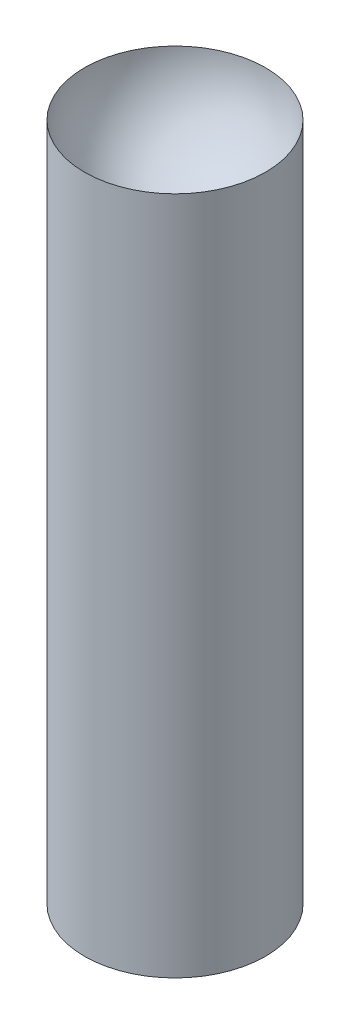
ISO-10303-21;
HEADER;
FILE_DESCRIPTION(('STEP AP214'),'2;1');
FILE_NAME('part.step','',(''),(''),'','','');
FILE_SCHEMA(('AUTOMOTIVE_DESIGN { 1 0 10303 214 1 1 1 1 }'));
ENDSEC;
DATA;
#1=APPLICATION_CONTEXT('core data for automotive mechanical design processes');
#2=APPLICATION_PROTOCOL_DEFINITION('international standard','automotive_design',2000,#1);
#3=PRODUCT_CONTEXT('',#1,'mechanical');
#4=PRODUCT('Part','Part','',(#3));
#5=PRODUCT_RELATED_PRODUCT_CATEGORY('part','',(#4));
#6=PRODUCT_DEFINITION_FORMATION('','',#4);
#7=PRODUCT_DEFINITION_CONTEXT('part definition',#1,'design');
#8=PRODUCT_DEFINITION('design','',#6,#7);
#9=PRODUCT_DEFINITION_SHAPE('','',#8);
#10=(LENGTH_UNIT() NAMED_UNIT(*) SI_UNIT(.MILLI.,.METRE.));
#11=(NAMED_UNIT(*) PLANE_ANGLE_UNIT() SI_UNIT($,.RADIAN.));
#12=(NAMED_UNIT(*) SI_UNIT($,.STERADIAN.) SOLID_ANGLE_UNIT());
#13=UNCERTAINTY_MEASURE_WITH_UNIT(LENGTH_MEASURE(1.E-05),#10,'distance_accuracy_value','');
#14=(GEOMETRIC_REPRESENTATION_CONTEXT(3) GLOBAL_UNCERTAINTY_ASSIGNED_CONTEXT((#13)) GLOBAL_UNIT_ASSIGNED_CONTEXT((#10,
#11,#12)) REPRESENTATION_CONTEXT('',''));
#15=CARTESIAN_POINT('',(0.,0.,0.));
#16=DIRECTION('',(0.,0.,1.));
#17=DIRECTION('',(1.,0.,0.));
#18=AXIS2_PLACEMENT_3D('',#15,#16,#17);
#19=CARTESIAN_POINT('',(0.,76.2,0.));
#20=DIRECTION('',(0.,-1.,0.));
#21=DIRECTION('',(0.,0.,-1.));
#22=AXIS2_PLACEMENT_3D('',#19,#20,#21);
#23=CYLINDRICAL_SURFACE('',#22,10.16);
#24=CARTESIAN_POINT('',(0.,76.2,0.));
#25=DIRECTION('',(0.,1.,0.));
#26=DIRECTION('',(0.,0.,1.));
#27=AXIS2_PLACEMENT_3D('',#24,#25,#26);
#28=CIRCLE('',#27,10.16);
#29=CARTESIAN_POINT('',(0.,76.2,-10.16));
#30=VERTEX_POINT('',#29);
#31=EDGE_CURVE('E37',#30,#30,#28,.F.);
#32=CARTESIAN_POINT('',(0.,0.,0.));
#33=DIRECTION('',(0.,1.,0.));
#34=DIRECTION('',(0.,0.,1.));
#35=AXIS2_PLACEMENT_3D('',#32,#33,#34);
#36=CIRCLE('',#35,10.16);
#37=CARTESIAN_POINT('',(0.,0.,-10.16));
#38=VERTEX_POINT('',#37);
#39=EDGE_CURVE('E10',#38,#38,#36,.T.);
#40=CARTESIAN_POINT('',(0.,76.2,-10.16));
#41=CARTESIAN_POINT('',(0.,75.40625,-10.16));
#42=CARTESIAN_POINT('',(0.,74.6125,-10.16));
#43=CARTESIAN_POINT('',(0.,73.025,-10.16));
#44=CARTESIAN_POINT('',(0.,72.23125,-10.16));
#45=CARTESIAN_POINT('',(0.,70.64375,-10.16));
#46=CARTESIAN_POINT('',(0.,69.85,-10.16));
#47=CARTESIAN_POINT('',(0.,68.2625,-10.16));
#48=CARTESIAN_POINT('',(0.,67.46875,-10.16));
#49=CARTESIAN_POINT('',(0.,65.88125,-10.16));
#50=CARTESIAN_POINT('',(0.,65.0875,-10.16));
#51=CARTESIAN_POINT('',(0.,63.5,-10.16));
#52=CARTESIAN_POINT('',(0.,62.70625,-10.16));
#53=CARTESIAN_POINT('',(0.,61.11875,-10.16));
#54=CARTESIAN_POINT('',(0.,60.325,-10.16));
#55=CARTESIAN_POINT('',(0.,58.7375,-10.16));
#56=CARTESIAN_POINT('',(0.,57.94375,-10.16));
#57=CARTESIAN_POINT('',(0.,56.35625,-10.16));
#58=CARTESIAN_POINT('',(0.,55.5625,-10.16));
#59=CARTESIAN_POINT('',(0.,53.975,-10.16));
#60=CARTESIAN_POINT('',(0.,53.18125,-10.16));
#61=CARTESIAN_POINT('',(0.,51.59375,-10.16));
#62=CARTESIAN_POINT('',(0.,50.8,-10.16));
#63=CARTESIAN_POINT('',(0.,49.2125,-10.16));
#64=CARTESIAN_POINT('',(0.,48.41875,-10.16));
#65=CARTESIAN_POINT('',(0.,46.83125,-10.16));
#66=CARTESIAN_POINT('',(0.,46.0375,-10.16));
#67=CARTESIAN_POINT('',(0.,44.45,-10.16));
#68=CARTESIAN_POINT('',(0.,43.65625,-10.16));
#69=CARTESIAN_POINT('',(0.,42.06875,-10.16));
#70=CARTESIAN_POINT('',(0.,41.275,-10.16));
#71=CARTESIAN_POINT('',(0.,39.6875,-10.16));
#72=CARTESIAN_POINT('',(0.,38.89375,-10.16));
#73=CARTESIAN_POINT('',(0.,37.30625,-10.16));
#74=CARTESIAN_POINT('',(0.,36.5125,-10.16));
#75=CARTESIAN_POINT('',(0.,34.925,-10.16));
#76=CARTESIAN_POINT('',(0.,34.13125,-10.16));
#77=CARTESIAN_POINT('',(0.,32.54375,-10.16));
#78=CARTESIAN_POINT('',(0.,31.75,-10.16));
#79=CARTESIAN_POINT('',(0.,30.1625,-10.16));
#80=CARTESIAN_POINT('',(0.,29.36875,-10.16));
#81=CARTESIAN_POINT('',(0.,27.78125,-10.16));
#82=CARTESIAN_POINT('',(0.,26.9875,-10.16));
#83=CARTESIAN_POINT('',(0.,25.4,-10.16));
#84=CARTESIAN_POINT('',(0.,24.60625,-10.16));
#85=CARTESIAN_POINT('',(0.,23.01875,-10.16));
#86=CARTESIAN_POINT('',(0.,22.225,-10.16));
#87=CARTESIAN_POINT('',(0.,20.6375,-10.16));
#88=CARTESIAN_POINT('',(0.,19.84375,-10.16));
#89=CARTESIAN_POINT('',(0.,18.25625,-10.16));
#90=CARTESIAN_POINT('',(0.,17.4625,-10.16));
#91=CARTESIAN_POINT('',(0.,15.875,-10.16));
#92=CARTESIAN_POINT('',(0.,15.08125,-10.16));
#93=CARTESIAN_POINT('',(0.,13.49375,-10.16));
#94=CARTESIAN_POINT('',(0.,12.7,-10.16));
#95=CARTESIAN_POINT('',(0.,11.1125,-10.16));
#96=CARTESIAN_POINT('',(0.,10.31875,-10.16));
#97=CARTESIAN_POINT('',(0.,8.73125,-10.16));
#98=CARTESIAN_POINT('',(0.,7.93750000000001,-10.16));
#99=CARTESIAN_POINT('',(0.,6.35,-10.16));
#100=CARTESIAN_POINT('',(0.,5.55625,-10.16));
#101=CARTESIAN_POINT('',(0.,3.96875,-10.16));
#102=CARTESIAN_POINT('',(0.,3.175,-10.16));
#103=CARTESIAN_POINT('',(0.,1.5875,-10.16));
#104=CARTESIAN_POINT('',(0.,0.793750000000001,-10.16));
#105=CARTESIAN_POINT('',(0.,0.,-10.16));
#106=B_SPLINE_CURVE_WITH_KNOTS('',3,(#40,#41,#42,#43,#44,#45,#46,#47,#48,#49,#50,#51,#52,#53,
#54,#55,#56,#57,#58,#59,#60,#61,#62,#63,#64,#65,#66,#67,#68,#69,#70,#71,#72,#73,#74,#75,#76,#77,
#78,#79,#80,#81,#82,#83,#84,#85,#86,#87,#88,#89,#90,#91,#92,#93,#94,#95,#96,#97,#98,#99,#100,
#101,#102,#103,#104,#105),.UNSPECIFIED.,.F.,.F.,(4,2,2,2,2,2,2,2,2,2,2,2,2,2,2,2,2,2,2,2,2,2,2,
2,2,2,2,2,2,2,2,2,4),(0.,2.38124999999999,4.76249999999999,7.14374999999999,9.52499999999999,
11.90625,14.2875,16.66875,19.05,21.43125,23.8125,26.19375,28.575,30.95625,33.3375,35.71875,38.1,
40.48125,42.8625,45.24375,47.625,50.00625,52.3875,54.76875,57.15,59.53125,61.9125,64.29375,
66.675,69.05625,71.4375,73.81875,76.2),.UNSPECIFIED.);
#107=EDGE_CURVE('BSEAM31',#30,#38,#106,.T.);
#108=ORIENTED_EDGE('',*,*,#31,.T.);
#109=ORIENTED_EDGE('',*,*,#39,.T.);
#110=ORIENTED_EDGE('',*,*,#107,.T.);
#111=ORIENTED_EDGE('',*,*,#107,.F.);
#112=EDGE_LOOP('',(#108,#110,#109,#111));
#113=FACE_BOUND('',#112,.T.);
#114=ADVANCED_FACE('F31',(#113),#23,.T.);
#115=CARTESIAN_POINT('',(0.,0.,0.));
#116=DIRECTION('',(0.,1.,0.));
#117=DIRECTION('',(0.,0.,1.));
#118=AXIS2_PLACEMENT_3D('',#115,#116,#117);
#119=PLANE('',#118);
#120=ORIENTED_EDGE('',*,*,#39,.F.);
#121=EDGE_LOOP('',(#120));
#122=FACE_BOUND('',#121,.T.);
#123=ADVANCED_FACE('F46',(#122),#119,.F.);
#124=CARTESIAN_POINT('',(0.,76.2,0.));
#125=DIRECTION('',(0.,0.,-1.));
#126=DIRECTION('',(1.,0.,0.));
#127=AXIS2_PLACEMENT_3D('',#124,#125,#126);
#128=SPHERICAL_SURFACE('',#127,10.16);
#129=CARTESIAN_POINT('',(0.,76.2,0.));
#130=DIRECTION('',(0.,1.,0.));
#131=DIRECTION('',(0.,0.,1.));
#132=AXIS2_PLACEMENT_3D('',#129,#130,#131);
#133=SPHERICAL_SURFACE('',#132,10.16);
#134=ORIENTED_EDGE('',*,*,#31,.F.);
#135=EDGE_LOOP('',(#134));
#136=FACE_BOUND('',#135,.T.);
#137=ADVANCED_FACE('F44',(#136),#133,.F.);
#138=CLOSED_SHELL('',(#114,#123,#137));
#139=MANIFOLD_SOLID_BREP('B2',#138);
#140=ADVANCED_BREP_SHAPE_REPRESENTATION('',(#18,#139),#14);
#141=SHAPE_DEFINITION_REPRESENTATION(#9,#140);
ENDSEC;
END-ISO-10303-21;
